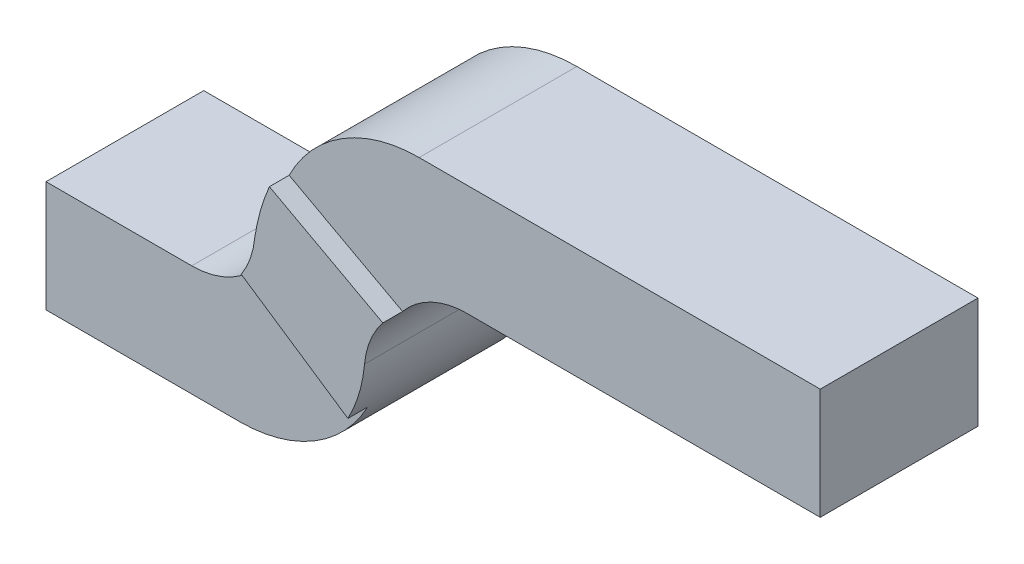
ISO-10303-21;
HEADER;
FILE_DESCRIPTION(('STEP AP214'),'2;1');
FILE_NAME('part.step','',(''),(''),'','','');
FILE_SCHEMA(('AUTOMOTIVE_DESIGN { 1 0 10303 214 1 1 1 1 }'));
ENDSEC;
DATA;
#1=APPLICATION_CONTEXT('core data for automotive mechanical design processes');
#2=APPLICATION_PROTOCOL_DEFINITION('international standard','automotive_design',2000,#1);
#3=PRODUCT_CONTEXT('',#1,'mechanical');
#4=PRODUCT('Part','Part','',(#3));
#5=PRODUCT_RELATED_PRODUCT_CATEGORY('part','',(#4));
#6=PRODUCT_DEFINITION_FORMATION('','',#4);
#7=PRODUCT_DEFINITION_CONTEXT('part definition',#1,'design');
#8=PRODUCT_DEFINITION('design','',#6,#7);
#9=PRODUCT_DEFINITION_SHAPE('','',#8);
#10=(LENGTH_UNIT() NAMED_UNIT(*) SI_UNIT(.MILLI.,.METRE.));
#11=(NAMED_UNIT(*) PLANE_ANGLE_UNIT() SI_UNIT($,.RADIAN.));
#12=(NAMED_UNIT(*) SI_UNIT($,.STERADIAN.) SOLID_ANGLE_UNIT());
#13=UNCERTAINTY_MEASURE_WITH_UNIT(LENGTH_MEASURE(1.E-05),#10,'distance_accuracy_value','');
#14=(GEOMETRIC_REPRESENTATION_CONTEXT(3) GLOBAL_UNCERTAINTY_ASSIGNED_CONTEXT((#13)) GLOBAL_UNIT_ASSIGNED_CONTEXT((#10,
#11,#12)) REPRESENTATION_CONTEXT('',''));
#15=CARTESIAN_POINT('',(0.,0.,0.));
#16=DIRECTION('',(0.,0.,1.));
#17=DIRECTION('',(1.,0.,0.));
#18=AXIS2_PLACEMENT_3D('',#15,#16,#17);
#19=CARTESIAN_POINT('',(-3.403007169133,-0.397885519354937,2.66));
#20=DIRECTION('',(0.556795491661779,0.830649613534562,0.));
#21=DIRECTION('',(-0.830649613534562,0.556795491661779,0.));
#22=AXIS2_PLACEMENT_3D('',#19,#20,#21);
#23=PLANE('',#22);
#24=DIRECTION('',(-0.830649613534562,0.556795491661779,0.));
#25=VECTOR('',#24,1.);
#26=CARTESIAN_POINT('',(-3.678554236215,-0.213182652836936,2.66));
#27=LINE('',#26,#25);
#28=CARTESIAN_POINT('',(-3.403007169133,-0.397885519354937,2.66));
#29=VERTEX_POINT('',#28);
#30=CARTESIAN_POINT('',(-3.917041555427,-0.0533214285714333,2.66));
#31=VERTEX_POINT('',#30);
#32=EDGE_CURVE('E11',#29,#31,#27,.T.);
#33=ORIENTED_EDGE('',*,*,#32,.F.);
#34=DIRECTION('',(0.,0.,1.));
#35=VECTOR('',#34,1.);
#36=CARTESIAN_POINT('',(-3.403007169133,-0.397885519354937,2.66));
#37=LINE('',#36,#35);
#38=CARTESIAN_POINT('',(-3.403007169133,-0.397885519354937,2.755));
#39=VERTEX_POINT('',#38);
#40=EDGE_CURVE('E24',#29,#39,#37,.T.);
#41=ORIENTED_EDGE('',*,*,#40,.T.);
#42=DIRECTION('',(-0.830649613534562,0.556795491661779,0.));
#43=VECTOR('',#42,1.);
#44=CARTESIAN_POINT('',(-3.403007169133,-0.397885519354937,2.755));
#45=LINE('',#44,#43);
#46=CARTESIAN_POINT('',(-3.917041555427,-0.0533214285714333,2.755));
#47=VERTEX_POINT('',#46);
#48=EDGE_CURVE('E305',#39,#47,#45,.T.);
#49=ORIENTED_EDGE('',*,*,#48,.T.);
#50=DIRECTION('',(0.,0.,1.));
#51=VECTOR('',#50,1.);
#52=CARTESIAN_POINT('',(-3.917041555427,-0.0533214285714333,2.66));
#53=LINE('',#52,#51);
#54=EDGE_CURVE('E303',#31,#47,#53,.T.);
#55=ORIENTED_EDGE('',*,*,#54,.F.);
#56=EDGE_LOOP('',(#33,#41,#49,#55));
#57=FACE_BOUND('',#56,.T.);
#58=ADVANCED_FACE('F17',(#57),#23,.F.);
#59=CARTESIAN_POINT('',(-2.86295437688,-0.0159202285700191,2.66));
#60=DIRECTION('',(0.,0.,-1.));
#61=DIRECTION('',(-0.989117940828201,0.147124774024568,0.));
#62=AXIS2_PLACEMENT_3D('',#59,#60,#61);
#63=CYLINDRICAL_SURFACE('',#62,0.999999999999969);
#64=CARTESIAN_POINT('',(-2.86295437688,-0.0159202285700191,2.66));
#65=DIRECTION('',(0.,0.,-1.));
#66=DIRECTION('',(-0.989117940828201,0.147124774024568,0.));
#67=AXIS2_PLACEMENT_3D('',#64,#65,#66);
#68=CIRCLE('',#67,0.999999999999969);
#69=CARTESIAN_POINT('',(-3.852072317709,0.131204545454545,2.66));
#70=VERTEX_POINT('',#69);
#71=CARTESIAN_POINT('',(-3.781179822614,0.380137886871121,2.66));
#72=VERTEX_POINT('',#71);
#73=EDGE_CURVE('E301',#70,#72,#68,.T.);
#74=ORIENTED_EDGE('',*,*,#73,.F.);
#75=DIRECTION('',(0.,0.,1.));
#76=VECTOR('',#75,1.);
#77=CARTESIAN_POINT('',(-3.852072317709,0.131204545454545,2.66));
#78=LINE('',#77,#76);
#79=CARTESIAN_POINT('',(-3.852072317709,0.131204545454545,2.755));
#80=VERTEX_POINT('',#79);
#81=EDGE_CURVE('E299',#70,#80,#78,.T.);
#82=ORIENTED_EDGE('',*,*,#81,.T.);
#83=CARTESIAN_POINT('',(-2.86295437688,-0.0159202285700191,2.755));
#84=DIRECTION('',(0.,0.,-1.));
#85=DIRECTION('',(-0.989117940828201,0.147124774024568,0.));
#86=AXIS2_PLACEMENT_3D('',#83,#84,#85);
#87=CIRCLE('',#86,0.999999999999969);
#88=CARTESIAN_POINT('',(-3.781179822614,0.380137886871121,2.755));
#89=VERTEX_POINT('',#88);
#90=EDGE_CURVE('E297',#80,#89,#87,.T.);
#91=ORIENTED_EDGE('',*,*,#90,.T.);
#92=DIRECTION('',(0.,0.,1.));
#93=VECTOR('',#92,1.);
#94=CARTESIAN_POINT('',(-3.781179822614,0.380137886871121,2.66));
#95=LINE('',#94,#93);
#96=EDGE_CURVE('E294',#72,#89,#95,.T.);
#97=ORIENTED_EDGE('',*,*,#96,.F.);
#98=EDGE_LOOP('',(#74,#82,#91,#97));
#99=FACE_BOUND('',#98,.T.);
#100=ADVANCED_FACE('F327',(#99),#63,.T.);
#101=CARTESIAN_POINT('',(-2.86295437688,-0.0159202285700191,2.66));
#102=DIRECTION('',(0.,0.,-1.));
#103=DIRECTION('',(-0.989117940828201,0.147124774024568,0.));
#104=AXIS2_PLACEMENT_3D('',#101,#102,#103);
#105=CYLINDRICAL_SURFACE('',#104,0.999999999999969);
#106=CARTESIAN_POINT('',(-2.86295437688,-0.0159202285700191,1.9));
#107=DIRECTION('',(0.,0.,1.));
#108=DIRECTION('',(-0.989117940828201,0.147124774024568,0.));
#109=AXIS2_PLACEMENT_3D('',#106,#107,#108);
#110=CIRCLE('',#109,0.999999999999969);
#111=CARTESIAN_POINT('',(-3.781179822614,0.380137886871121,1.9));
#112=VERTEX_POINT('',#111);
#113=CARTESIAN_POINT('',(-3.852072317709,0.131204545454545,1.9));
#114=VERTEX_POINT('',#113);
#115=EDGE_CURVE('E292',#112,#114,#110,.T.);
#116=ORIENTED_EDGE('',*,*,#115,.F.);
#117=DIRECTION('',(0.,0.,1.));
#118=VECTOR('',#117,1.);
#119=CARTESIAN_POINT('',(-3.781179822614,0.380137886871121,2.66));
#120=LINE('',#119,#118);
#121=CARTESIAN_POINT('',(-3.781179822614,0.380137886871121,1.805));
#122=VERTEX_POINT('',#121);
#123=EDGE_CURVE('E289',#122,#112,#120,.T.);
#124=ORIENTED_EDGE('',*,*,#123,.F.);
#125=CARTESIAN_POINT('',(-2.86295437688,-0.0159202285700191,1.805));
#126=DIRECTION('',(0.,0.,1.));
#127=DIRECTION('',(-0.989117940828201,0.147124774024568,0.));
#128=AXIS2_PLACEMENT_3D('',#125,#126,#127);
#129=CIRCLE('',#128,0.999999999999969);
#130=CARTESIAN_POINT('',(-3.852072317709,0.131204545454545,1.805));
#131=VERTEX_POINT('',#130);
#132=EDGE_CURVE('E287',#122,#131,#129,.T.);
#133=ORIENTED_EDGE('',*,*,#132,.T.);
#134=DIRECTION('',(0.,0.,1.));
#135=VECTOR('',#134,1.);
#136=CARTESIAN_POINT('',(-3.852072317709,0.131204545454545,2.66));
#137=LINE('',#136,#135);
#138=EDGE_CURVE('E284',#131,#114,#137,.T.);
#139=ORIENTED_EDGE('',*,*,#138,.T.);
#140=EDGE_LOOP('',(#116,#124,#133,#139));
#141=FACE_BOUND('',#140,.T.);
#142=ADVANCED_FACE('F354',(#141),#105,.T.);
#143=CARTESIAN_POINT('',(-3.781179822614,0.380137886871121,2.66));
#144=DIRECTION('',(-0.475278242984144,-0.879835548125845,0.));
#145=DIRECTION('',(0.879835548125845,-0.475278242984144,0.));
#146=AXIS2_PLACEMENT_3D('',#143,#144,#145);
#147=PLANE('',#146);
#148=DIRECTION('',(0.879835548125845,-0.475278242984144,0.));
#149=VECTOR('',#148,1.);
#150=CARTESIAN_POINT('',(-3.786410356881,0.382963368452674,2.66));
#151=LINE('',#150,#149);
#152=CARTESIAN_POINT('',(-3.23468731074,0.0849281725091644,2.66));
#153=VERTEX_POINT('',#152);
#154=EDGE_CURVE('E282',#72,#153,#151,.T.);
#155=ORIENTED_EDGE('',*,*,#154,.F.);
#156=ORIENTED_EDGE('',*,*,#96,.T.);
#157=DIRECTION('',(0.879835548125845,-0.475278242984144,0.));
#158=VECTOR('',#157,1.);
#159=CARTESIAN_POINT('',(-3.781179822614,0.380137886871121,2.755));
#160=LINE('',#159,#158);
#161=CARTESIAN_POINT('',(-3.23468731074,0.0849281725091644,2.755));
#162=VERTEX_POINT('',#161);
#163=EDGE_CURVE('E280',#89,#162,#160,.T.);
#164=ORIENTED_EDGE('',*,*,#163,.T.);
#165=DIRECTION('',(0.,0.,1.));
#166=VECTOR('',#165,1.);
#167=CARTESIAN_POINT('',(-3.23468731074,0.0849281725091644,2.66));
#168=LINE('',#167,#166);
#169=EDGE_CURVE('E277',#153,#162,#168,.T.);
#170=ORIENTED_EDGE('',*,*,#169,.F.);
#171=EDGE_LOOP('',(#155,#156,#164,#170));
#172=FACE_BOUND('',#171,.T.);
#173=ADVANCED_FACE('F323',(#172),#147,.F.);
#174=CARTESIAN_POINT('',(-3.781179822614,0.380137886871121,2.66));
#175=DIRECTION('',(-0.475278242984144,-0.879835548125845,0.));
#176=DIRECTION('',(0.879835548125845,-0.475278242984144,0.));
#177=AXIS2_PLACEMENT_3D('',#174,#175,#176);
#178=PLANE('',#177);
#179=DIRECTION('',(-0.879835548125845,0.475278242984144,0.));
#180=VECTOR('',#179,1.);
#181=CARTESIAN_POINT('',(-2.871767942995,-0.111117190529642,1.9));
#182=LINE('',#181,#180);
#183=CARTESIAN_POINT('',(-3.23468731074,0.0849281725091644,1.9));
#184=VERTEX_POINT('',#183);
#185=EDGE_CURVE('E274',#184,#112,#182,.T.);
#186=ORIENTED_EDGE('',*,*,#185,.F.);
#187=DIRECTION('',(0.,0.,1.));
#188=VECTOR('',#187,1.);
#189=CARTESIAN_POINT('',(-3.23468731074,0.0849281725091644,2.66));
#190=LINE('',#189,#188);
#191=CARTESIAN_POINT('',(-3.23468731074,0.0849281725091644,1.805));
#192=VERTEX_POINT('',#191);
#193=EDGE_CURVE('E271',#192,#184,#190,.T.);
#194=ORIENTED_EDGE('',*,*,#193,.F.);
#195=DIRECTION('',(-0.879835548125845,0.475278242984144,0.));
#196=VECTOR('',#195,1.);
#197=CARTESIAN_POINT('',(-3.781179822614,0.380137886871121,1.805));
#198=LINE('',#197,#196);
#199=EDGE_CURVE('E268',#192,#122,#198,.T.);
#200=ORIENTED_EDGE('',*,*,#199,.T.);
#201=ORIENTED_EDGE('',*,*,#123,.T.);
#202=EDGE_LOOP('',(#186,#194,#200,#201));
#203=FACE_BOUND('',#202,.T.);
#204=ADVANCED_FACE('F363',(#203),#178,.F.);
#205=CARTESIAN_POINT('',(-3.578362557757,0.000382367456053226,1.805));
#206=DIRECTION('',(0.,0.,1.));
#207=DIRECTION('',(1.,0.,0.));
#208=AXIS2_PLACEMENT_3D('',#205,#206,#207);
#209=PLANE('',#208);
#210=CARTESIAN_POINT('',(-4.02,-0.0672500000000006,1.805));
#211=DIRECTION('',(0.,0.,1.));
#212=DIRECTION('',(0.995817596726636,-0.091363636363636,0.));
#213=AXIS2_PLACEMENT_3D('',#210,#211,#212);
#214=CIRCLE('',#213,0.7);
#215=CARTESIAN_POINT('',(-3.403007169133,-0.397885519354937,1.805));
#216=VERTEX_POINT('',#215);
#217=CARTESIAN_POINT('',(-3.322927682291,-0.131204545454546,1.805));
#218=VERTEX_POINT('',#217);
#219=EDGE_CURVE('E266',#216,#218,#214,.T.);
#220=ORIENTED_EDGE('',*,*,#219,.F.);
#221=DIRECTION('',(0.830649613534562,-0.556795491661779,0.));
#222=VECTOR('',#221,1.);
#223=CARTESIAN_POINT('',(-3.403007169133,-0.397885519354937,1.805));
#224=LINE('',#223,#222);
#225=CARTESIAN_POINT('',(-3.917041555427,-0.0533214285714333,1.805));
#226=VERTEX_POINT('',#225);
#227=EDGE_CURVE('E263',#226,#216,#224,.T.);
#228=ORIENTED_EDGE('',*,*,#227,.F.);
#229=CARTESIAN_POINT('',(-4.250399356399,0.167750000000002,1.805));
#230=DIRECTION('',(0.,0.,-1.));
#231=DIRECTION('',(-0.995817596726636,0.091363636363637,0.));
#232=AXIS2_PLACEMENT_3D('',#229,#230,#231);
#233=CIRCLE('',#232,0.400000000000023);
#234=EDGE_CURVE('E260',#131,#226,#233,.T.);
#235=ORIENTED_EDGE('',*,*,#234,.F.);
#236=ORIENTED_EDGE('',*,*,#132,.F.);
#237=ORIENTED_EDGE('',*,*,#199,.F.);
#238=CARTESIAN_POINT('',(-2.924600643601,-0.167749999999997,1.805));
#239=DIRECTION('',(0.,0.,-1.));
#240=DIRECTION('',(0.995817596726637,-0.09136363636363,0.));
#241=AXIS2_PLACEMENT_3D('',#238,#239,#240);
#242=CIRCLE('',#241,0.399999999999992);
#243=EDGE_CURVE('E257',#218,#192,#242,.T.);
#244=ORIENTED_EDGE('',*,*,#243,.F.);
#245=EDGE_LOOP('',(#220,#228,#235,#236,#237,#244));
#246=FACE_BOUND('',#245,.T.);
#247=ADVANCED_FACE('F366',(#246),#209,.F.);
#248=CARTESIAN_POINT('',(-3.403007169133,-0.397885519354937,2.66));
#249=DIRECTION('',(0.556795491661779,0.830649613534562,0.));
#250=DIRECTION('',(-0.830649613534562,0.556795491661779,0.));
#251=AXIS2_PLACEMENT_3D('',#248,#249,#250);
#252=PLANE('',#251);
#253=DIRECTION('',(0.830649613534562,-0.556795491661779,0.));
#254=VECTOR('',#253,1.);
#255=CARTESIAN_POINT('',(-2.92019406112,-0.721521571760761,1.9));
#256=LINE('',#255,#254);
#257=CARTESIAN_POINT('',(-3.917041555427,-0.0533214285714333,1.9));
#258=VERTEX_POINT('',#257);
#259=CARTESIAN_POINT('',(-3.403007169133,-0.397885519354936,1.9));
#260=VERTEX_POINT('',#259);
#261=EDGE_CURVE('E255',#258,#260,#256,.T.);
#262=ORIENTED_EDGE('',*,*,#261,.F.);
#263=DIRECTION('',(0.,0.,1.));
#264=VECTOR('',#263,1.);
#265=CARTESIAN_POINT('',(-3.917041555427,-0.0533214285714333,2.66));
#266=LINE('',#265,#264);
#267=EDGE_CURVE('E253',#226,#258,#266,.T.);
#268=ORIENTED_EDGE('',*,*,#267,.F.);
#269=ORIENTED_EDGE('',*,*,#227,.T.);
#270=DIRECTION('',(0.,0.,1.));
#271=VECTOR('',#270,1.);
#272=CARTESIAN_POINT('',(-3.403007169133,-0.397885519354937,2.66));
#273=LINE('',#272,#271);
#274=EDGE_CURVE('E250',#216,#260,#273,.T.);
#275=ORIENTED_EDGE('',*,*,#274,.T.);
#276=EDGE_LOOP('',(#262,#268,#269,#275));
#277=FACE_BOUND('',#276,.T.);
#278=ADVANCED_FACE('F370',(#277),#252,.F.);
#279=CARTESIAN_POINT('',(-3.578362557757,0.000382367456053226,2.755));
#280=DIRECTION('',(0.,0.,1.));
#281=DIRECTION('',(1.,0.,0.));
#282=AXIS2_PLACEMENT_3D('',#279,#280,#281);
#283=PLANE('',#282);
#284=CARTESIAN_POINT('',(-4.02,-0.0672500000000006,2.755));
#285=DIRECTION('',(0.,0.,-1.));
#286=DIRECTION('',(0.995817596726636,-0.091363636363636,0.));
#287=AXIS2_PLACEMENT_3D('',#284,#285,#286);
#288=CIRCLE('',#287,0.7);
#289=CARTESIAN_POINT('',(-3.322927682291,-0.131204545454546,2.755));
#290=VERTEX_POINT('',#289);
#291=EDGE_CURVE('E247',#290,#39,#288,.T.);
#292=ORIENTED_EDGE('',*,*,#291,.F.);
#293=CARTESIAN_POINT('',(-2.924600643601,-0.167749999999997,2.755));
#294=DIRECTION('',(0.,0.,1.));
#295=DIRECTION('',(0.995817596726637,-0.09136363636363,0.));
#296=AXIS2_PLACEMENT_3D('',#293,#294,#295);
#297=CIRCLE('',#296,0.399999999999992);
#298=EDGE_CURVE('E244',#162,#290,#297,.T.);
#299=ORIENTED_EDGE('',*,*,#298,.F.);
#300=ORIENTED_EDGE('',*,*,#163,.F.);
#301=ORIENTED_EDGE('',*,*,#90,.F.);
#302=CARTESIAN_POINT('',(-4.250399356399,0.167750000000002,2.755));
#303=DIRECTION('',(0.,0.,1.));
#304=DIRECTION('',(-0.995817596726636,0.091363636363637,0.));
#305=AXIS2_PLACEMENT_3D('',#302,#303,#304);
#306=CIRCLE('',#305,0.400000000000023);
#307=EDGE_CURVE('E241',#47,#80,#306,.T.);
#308=ORIENTED_EDGE('',*,*,#307,.F.);
#309=ORIENTED_EDGE('',*,*,#48,.F.);
#310=EDGE_LOOP('',(#292,#299,#300,#301,#308,#309));
#311=FACE_BOUND('',#310,.T.);
#312=ADVANCED_FACE('F310',(#311),#283,.T.);
#313=CARTESIAN_POINT('',(-4.02,-0.0672500000000006,0.));
#314=DIRECTION('',(0.,0.,1.));
#315=DIRECTION('',(0.707106781186547,-0.707106781186548,0.));
#316=AXIS2_PLACEMENT_3D('',#313,#314,#315);
#317=CYLINDRICAL_SURFACE('',#316,0.7);
#318=CARTESIAN_POINT('',(-4.02,-0.0672500000000006,2.66));
#319=DIRECTION('',(0.,0.,-1.));
#320=DIRECTION('',(0.707106781186547,-0.707106781186548,0.));
#321=AXIS2_PLACEMENT_3D('',#318,#319,#320);
#322=CIRCLE('',#321,0.7);
#323=CARTESIAN_POINT('',(-4.02,-0.767250000000001,2.66));
#324=VERTEX_POINT('',#323);
#325=EDGE_CURVE('E239',#29,#324,#322,.T.);
#326=ORIENTED_EDGE('',*,*,#325,.T.);
#327=DIRECTION('',(0.,0.,-1.));
#328=VECTOR('',#327,1.);
#329=CARTESIAN_POINT('',(-4.02,-0.767250000000001,0.));
#330=LINE('',#329,#328);
#331=CARTESIAN_POINT('',(-4.02,-0.767250000000001,1.9));
#332=VERTEX_POINT('',#331);
#333=EDGE_CURVE('E237',#324,#332,#330,.T.);
#334=ORIENTED_EDGE('',*,*,#333,.T.);
#335=CARTESIAN_POINT('',(-4.02,-0.0672500000000006,1.9));
#336=DIRECTION('',(0.,0.,1.));
#337=DIRECTION('',(0.707106781186547,-0.707106781186548,0.));
#338=AXIS2_PLACEMENT_3D('',#335,#336,#337);
#339=CIRCLE('',#338,0.7);
#340=EDGE_CURVE('E234',#332,#260,#339,.T.);
#341=ORIENTED_EDGE('',*,*,#340,.T.);
#342=ORIENTED_EDGE('',*,*,#274,.F.);
#343=ORIENTED_EDGE('',*,*,#219,.T.);
#344=DIRECTION('',(0.,0.,-1.));
#345=VECTOR('',#344,1.);
#346=CARTESIAN_POINT('',(-3.322927682291,-0.131204545454546,2.66));
#347=LINE('',#346,#345);
#348=EDGE_CURVE('E231',#290,#218,#347,.T.);
#349=ORIENTED_EDGE('',*,*,#348,.F.);
#350=ORIENTED_EDGE('',*,*,#291,.T.);
#351=ORIENTED_EDGE('',*,*,#40,.F.);
#352=EDGE_LOOP('',(#326,#334,#341,#342,#343,#349,#350,#351));
#353=FACE_BOUND('',#352,.T.);
#354=ADVANCED_FACE('F314',(#353),#317,.T.);
#355=CARTESIAN_POINT('',(-1.2225,0.767249999999999,1.9));
#356=DIRECTION('',(0.,0.,1.));
#357=DIRECTION('',(-1.,0.,0.));
#358=AXIS2_PLACEMENT_3D('',#355,#356,#357);
#359=PLANE('',#358);
#360=ORIENTED_EDGE('',*,*,#185,.T.);
#361=CARTESIAN_POINT('',(-3.155,0.0672499999999988,1.9));
#362=DIRECTION('',(0.,0.,1.));
#363=DIRECTION('',(-0.707106781186547,0.707106781186548,0.));
#364=AXIS2_PLACEMENT_3D('',#361,#362,#363);
#365=CIRCLE('',#364,0.7);
#366=CARTESIAN_POINT('',(-3.155,0.767249999999999,1.9));
#367=VERTEX_POINT('',#366);
#368=EDGE_CURVE('E228',#367,#112,#365,.T.);
#369=ORIENTED_EDGE('',*,*,#368,.F.);
#370=DIRECTION('',(-1.,0.,0.));
#371=VECTOR('',#370,1.);
#372=CARTESIAN_POINT('',(-2.27125,0.767249999999999,1.9));
#373=LINE('',#372,#371);
#374=CARTESIAN_POINT('',(-1.2225,0.767249999999999,1.9));
#375=VERTEX_POINT('',#374);
#376=EDGE_CURVE('E225',#375,#367,#373,.T.);
#377=ORIENTED_EDGE('',*,*,#376,.F.);
#378=DIRECTION('',(0.,1.,0.));
#379=VECTOR('',#378,1.);
#380=CARTESIAN_POINT('',(-1.2225,0.499749999999999,1.9));
#381=LINE('',#380,#379);
#382=CARTESIAN_POINT('',(-1.2225,0.23225,1.9));
#383=VERTEX_POINT('',#382);
#384=EDGE_CURVE('E222',#383,#375,#381,.T.);
#385=ORIENTED_EDGE('',*,*,#384,.F.);
#386=DIRECTION('',(1.,0.,0.));
#387=VECTOR('',#386,1.);
#388=CARTESIAN_POINT('',(-1.7225,0.23225,1.9));
#389=LINE('',#388,#387);
#390=CARTESIAN_POINT('',(-2.924600643601,0.23225,1.9));
#391=VERTEX_POINT('',#390);
#392=EDGE_CURVE('E219',#391,#383,#389,.T.);
#393=ORIENTED_EDGE('',*,*,#392,.F.);
#394=CARTESIAN_POINT('',(-2.924600643601,-0.16775,1.9));
#395=DIRECTION('',(0.,0.,-1.));
#396=DIRECTION('',(0.,-1.,0.));
#397=AXIS2_PLACEMENT_3D('',#394,#395,#396);
#398=CIRCLE('',#397,0.4);
#399=EDGE_CURVE('E216',#184,#391,#398,.T.);
#400=ORIENTED_EDGE('',*,*,#399,.F.);
#401=EDGE_LOOP('',(#360,#369,#377,#385,#393,#400));
#402=FACE_BOUND('',#401,.T.);
#403=ADVANCED_FACE('F379',(#402),#359,.F.);
#404=CARTESIAN_POINT('',(-1.2225,0.767249999999999,1.9));
#405=DIRECTION('',(0.,0.,1.));
#406=DIRECTION('',(-1.,0.,0.));
#407=AXIS2_PLACEMENT_3D('',#404,#405,#406);
#408=PLANE('',#407);
#409=ORIENTED_EDGE('',*,*,#115,.T.);
#410=CARTESIAN_POINT('',(-3.155,0.0672499999999988,1.9));
#411=DIRECTION('',(0.,0.,1.));
#412=DIRECTION('',(-0.707106781186547,0.707106781186548,0.));
#413=AXIS2_PLACEMENT_3D('',#410,#411,#412);
#414=CIRCLE('',#413,0.7);
#415=EDGE_CURVE('E213',#112,#114,#414,.T.);
#416=ORIENTED_EDGE('',*,*,#415,.F.);
#417=EDGE_LOOP('',(#409,#416));
#418=FACE_BOUND('',#417,.T.);
#419=ADVANCED_FACE('F382',(#418),#408,.F.);
#420=CARTESIAN_POINT('',(-1.2225,0.767249999999999,1.9));
#421=DIRECTION('',(0.,0.,1.));
#422=DIRECTION('',(-1.,0.,0.));
#423=AXIS2_PLACEMENT_3D('',#420,#421,#422);
#424=PLANE('',#423);
#425=ORIENTED_EDGE('',*,*,#261,.T.);
#426=ORIENTED_EDGE('',*,*,#340,.F.);
#427=DIRECTION('',(1.,0.,0.));
#428=VECTOR('',#427,1.);
#429=CARTESIAN_POINT('',(-2.53875,-0.767250000000001,1.9));
#430=LINE('',#429,#428);
#431=CARTESIAN_POINT('',(-4.9525,-0.76725,1.9));
#432=VERTEX_POINT('',#431);
#433=EDGE_CURVE('E210',#432,#332,#430,.T.);
#434=ORIENTED_EDGE('',*,*,#433,.F.);
#435=DIRECTION('',(0.,-1.,0.));
#436=VECTOR('',#435,1.);
#437=CARTESIAN_POINT('',(-4.9525,0.267499999999999,1.9));
#438=LINE('',#437,#436);
#439=CARTESIAN_POINT('',(-4.9525,-0.232250000000001,1.9));
#440=VERTEX_POINT('',#439);
#441=EDGE_CURVE('E207',#440,#432,#438,.T.);
#442=ORIENTED_EDGE('',*,*,#441,.F.);
#443=DIRECTION('',(-1.,0.,0.));
#444=VECTOR('',#443,1.);
#445=CARTESIAN_POINT('',(-2.405,-0.23225,1.9));
#446=LINE('',#445,#444);
#447=CARTESIAN_POINT('',(-4.250399356399,-0.23225,1.9));
#448=VERTEX_POINT('',#447);
#449=EDGE_CURVE('E205',#448,#440,#446,.T.);
#450=ORIENTED_EDGE('',*,*,#449,.F.);
#451=CARTESIAN_POINT('',(-4.250399356399,0.16775,1.9));
#452=DIRECTION('',(0.,0.,-1.));
#453=DIRECTION('',(0.,1.,0.));
#454=AXIS2_PLACEMENT_3D('',#451,#452,#453);
#455=CIRCLE('',#454,0.4);
#456=EDGE_CURVE('E165',#258,#448,#455,.T.);
#457=ORIENTED_EDGE('',*,*,#456,.F.);
#458=EDGE_LOOP('',(#425,#426,#434,#442,#450,#457));
#459=FACE_BOUND('',#458,.T.);
#460=ADVANCED_FACE('F386',(#459),#424,.F.);
#461=CARTESIAN_POINT('',(-3.155,0.0672499999999988,0.));
#462=DIRECTION('',(0.,0.,1.));
#463=DIRECTION('',(-0.707106781186547,0.707106781186548,0.));
#464=AXIS2_PLACEMENT_3D('',#461,#462,#463);
#465=CYLINDRICAL_SURFACE('',#464,0.7);
#466=CARTESIAN_POINT('',(-3.155,0.0672499999999988,2.66));
#467=DIRECTION('',(0.,0.,-1.));
#468=DIRECTION('',(-0.707106781186547,0.707106781186548,0.));
#469=AXIS2_PLACEMENT_3D('',#466,#467,#468);
#470=CIRCLE('',#469,0.7);
#471=CARTESIAN_POINT('',(-3.155,0.767249999999999,2.66));
#472=VERTEX_POINT('',#471);
#473=EDGE_CURVE('E202',#72,#472,#470,.T.);
#474=ORIENTED_EDGE('',*,*,#473,.T.);
#475=DIRECTION('',(0.,0.,-1.));
#476=VECTOR('',#475,1.);
#477=CARTESIAN_POINT('',(-3.155,0.767249999999999,0.));
#478=LINE('',#477,#476);
#479=EDGE_CURVE('E199',#472,#367,#478,.T.);
#480=ORIENTED_EDGE('',*,*,#479,.T.);
#481=ORIENTED_EDGE('',*,*,#368,.T.);
#482=ORIENTED_EDGE('',*,*,#415,.T.);
#483=DIRECTION('',(0.,0.,-1.));
#484=VECTOR('',#483,1.);
#485=CARTESIAN_POINT('',(-3.852072317709,0.131204545454545,0.));
#486=LINE('',#485,#484);
#487=EDGE_CURVE('E196',#70,#114,#486,.T.);
#488=ORIENTED_EDGE('',*,*,#487,.F.);
#489=CARTESIAN_POINT('',(-3.155,0.0672499999999988,2.66));
#490=DIRECTION('',(0.,0.,-1.));
#491=DIRECTION('',(-0.707106781186547,0.707106781186548,0.));
#492=AXIS2_PLACEMENT_3D('',#489,#490,#491);
#493=CIRCLE('',#492,0.7);
#494=EDGE_CURVE('E193',#70,#72,#493,.T.);
#495=ORIENTED_EDGE('',*,*,#494,.T.);
#496=EDGE_LOOP('',(#474,#480,#481,#482,#488,#495));
#497=FACE_BOUND('',#496,.T.);
#498=ADVANCED_FACE('F333',(#497),#465,.T.);
#499=CARTESIAN_POINT('',(-4.27,-0.499750000000001,2.66));
#500=DIRECTION('',(0.,0.,1.));
#501=DIRECTION('',(1.,0.,0.));
#502=AXIS2_PLACEMENT_3D('',#499,#500,#501);
#503=PLANE('',#502);
#504=ORIENTED_EDGE('',*,*,#154,.T.);
#505=CARTESIAN_POINT('',(-2.924600643601,-0.16775,2.66));
#506=DIRECTION('',(0.,0.,1.));
#507=DIRECTION('',(0.,-1.,0.));
#508=AXIS2_PLACEMENT_3D('',#505,#506,#507);
#509=CIRCLE('',#508,0.4);
#510=CARTESIAN_POINT('',(-2.924600643601,0.232249999999999,2.66));
#511=VERTEX_POINT('',#510);
#512=EDGE_CURVE('E190',#511,#153,#509,.T.);
#513=ORIENTED_EDGE('',*,*,#512,.F.);
#514=DIRECTION('',(1.,0.,0.));
#515=VECTOR('',#514,1.);
#516=CARTESIAN_POINT('',(-3.5875,0.232249999999999,2.66));
#517=LINE('',#516,#515);
#518=CARTESIAN_POINT('',(-1.2225,0.23225,2.66));
#519=VERTEX_POINT('',#518);
#520=EDGE_CURVE('E188',#511,#519,#517,.T.);
#521=ORIENTED_EDGE('',*,*,#520,.T.);
#522=DIRECTION('',(0.,1.,0.));
#523=VECTOR('',#522,1.);
#524=CARTESIAN_POINT('',(-1.2225,0.23225,2.66));
#525=LINE('',#524,#523);
#526=CARTESIAN_POINT('',(-1.2225,0.76725,2.66));
#527=VERTEX_POINT('',#526);
#528=EDGE_CURVE('E186',#519,#527,#525,.T.);
#529=ORIENTED_EDGE('',*,*,#528,.T.);
#530=DIRECTION('',(-1.,0.,0.));
#531=VECTOR('',#530,1.);
#532=CARTESIAN_POINT('',(-2.2225,0.76725,2.66));
#533=LINE('',#532,#531);
#534=EDGE_CURVE('E183',#527,#472,#533,.T.);
#535=ORIENTED_EDGE('',*,*,#534,.T.);
#536=ORIENTED_EDGE('',*,*,#473,.F.);
#537=EDGE_LOOP('',(#504,#513,#521,#529,#535,#536));
#538=FACE_BOUND('',#537,.T.);
#539=ADVANCED_FACE('F339',(#538),#503,.T.);
#540=CARTESIAN_POINT('',(-4.27,-0.499750000000001,2.66));
#541=DIRECTION('',(0.,0.,1.));
#542=DIRECTION('',(1.,0.,0.));
#543=AXIS2_PLACEMENT_3D('',#540,#541,#542);
#544=PLANE('',#543);
#545=ORIENTED_EDGE('',*,*,#73,.T.);
#546=ORIENTED_EDGE('',*,*,#494,.F.);
#547=EDGE_LOOP('',(#545,#546));
#548=FACE_BOUND('',#547,.T.);
#549=ADVANCED_FACE('F336',(#548),#544,.T.);
#550=CARTESIAN_POINT('',(-4.9525,-0.232250000000001,0.));
#551=DIRECTION('',(-1.,0.,0.));
#552=DIRECTION('',(0.,-1.,0.));
#553=AXIS2_PLACEMENT_3D('',#550,#551,#552);
#554=PLANE('',#553);
#555=ORIENTED_EDGE('',*,*,#441,.T.);
#556=DIRECTION('',(0.,0.,1.));
#557=VECTOR('',#556,1.);
#558=CARTESIAN_POINT('',(-4.9525,-0.767250000000001,0.));
#559=LINE('',#558,#557);
#560=CARTESIAN_POINT('',(-4.9525,-0.767250000000001,2.66));
#561=VERTEX_POINT('',#560);
#562=EDGE_CURVE('E181',#432,#561,#559,.T.);
#563=ORIENTED_EDGE('',*,*,#562,.T.);
#564=DIRECTION('',(0.,-1.,0.));
#565=VECTOR('',#564,1.);
#566=CARTESIAN_POINT('',(-4.9525,-0.232250000000001,2.66));
#567=LINE('',#566,#565);
#568=CARTESIAN_POINT('',(-4.9525,-0.232250000000001,2.66));
#569=VERTEX_POINT('',#568);
#570=EDGE_CURVE('E179',#569,#561,#567,.T.);
#571=ORIENTED_EDGE('',*,*,#570,.F.);
#572=DIRECTION('',(0.,0.,1.));
#573=VECTOR('',#572,1.);
#574=CARTESIAN_POINT('',(-4.9525,-0.232250000000001,0.));
#575=LINE('',#574,#573);
#576=EDGE_CURVE('E150',#440,#569,#575,.T.);
#577=ORIENTED_EDGE('',*,*,#576,.F.);
#578=EDGE_LOOP('',(#555,#563,#571,#577));
#579=FACE_BOUND('',#578,.T.);
#580=ADVANCED_FACE('F338',(#579),#554,.T.);
#581=CARTESIAN_POINT('',(-4.27,-0.499750000000001,2.66));
#582=DIRECTION('',(0.,0.,1.));
#583=DIRECTION('',(1.,0.,0.));
#584=AXIS2_PLACEMENT_3D('',#581,#582,#583);
#585=PLANE('',#584);
#586=ORIENTED_EDGE('',*,*,#32,.T.);
#587=CARTESIAN_POINT('',(-4.250399356399,0.16775,2.66));
#588=DIRECTION('',(0.,0.,1.));
#589=DIRECTION('',(0.,1.,0.));
#590=AXIS2_PLACEMENT_3D('',#587,#588,#589);
#591=CIRCLE('',#590,0.4);
#592=CARTESIAN_POINT('',(-4.250399356399,-0.23225,2.66));
#593=VERTEX_POINT('',#592);
#594=EDGE_CURVE('E142',#593,#31,#591,.T.);
#595=ORIENTED_EDGE('',*,*,#594,.F.);
#596=DIRECTION('',(-1.,0.,0.));
#597=VECTOR('',#596,1.);
#598=CARTESIAN_POINT('',(-3.5875,-0.23225,2.66));
#599=LINE('',#598,#597);
#600=EDGE_CURVE('E146',#593,#569,#599,.T.);
#601=ORIENTED_EDGE('',*,*,#600,.T.);
#602=ORIENTED_EDGE('',*,*,#570,.T.);
#603=DIRECTION('',(1.,0.,0.));
#604=VECTOR('',#603,1.);
#605=CARTESIAN_POINT('',(-3.855,-0.767250000000001,2.66));
#606=LINE('',#605,#604);
#607=EDGE_CURVE('E159',#561,#324,#606,.T.);
#608=ORIENTED_EDGE('',*,*,#607,.T.);
#609=ORIENTED_EDGE('',*,*,#325,.F.);
#610=EDGE_LOOP('',(#586,#595,#601,#602,#608,#609));
#611=FACE_BOUND('',#610,.T.);
#612=ADVANCED_FACE('F144',(#611),#585,.T.);
#613=CARTESIAN_POINT('',(-3.855,-0.767250000000001,0.));
#614=DIRECTION('',(0.,-1.,0.));
#615=DIRECTION('',(1.,0.,0.));
#616=AXIS2_PLACEMENT_3D('',#613,#614,#615);
#617=PLANE('',#616);
#618=ORIENTED_EDGE('',*,*,#433,.T.);
#619=ORIENTED_EDGE('',*,*,#333,.F.);
#620=ORIENTED_EDGE('',*,*,#607,.F.);
#621=ORIENTED_EDGE('',*,*,#562,.F.);
#622=EDGE_LOOP('',(#618,#619,#620,#621));
#623=FACE_BOUND('',#622,.T.);
#624=ADVANCED_FACE('F427',(#623),#617,.T.);
#625=CARTESIAN_POINT('',(-2.924600643601,-0.16775,0.));
#626=DIRECTION('',(0.,0.,1.));
#627=DIRECTION('',(0.,-1.,0.));
#628=AXIS2_PLACEMENT_3D('',#625,#626,#627);
#629=CYLINDRICAL_SURFACE('',#628,0.4);
#630=ORIENTED_EDGE('',*,*,#399,.T.);
#631=DIRECTION('',(0.,0.,1.));
#632=VECTOR('',#631,1.);
#633=CARTESIAN_POINT('',(-2.924600643601,0.23225,0.));
#634=LINE('',#633,#632);
#635=EDGE_CURVE('E166',#391,#511,#634,.T.);
#636=ORIENTED_EDGE('',*,*,#635,.T.);
#637=ORIENTED_EDGE('',*,*,#512,.T.);
#638=ORIENTED_EDGE('',*,*,#169,.T.);
#639=ORIENTED_EDGE('',*,*,#298,.T.);
#640=ORIENTED_EDGE('',*,*,#348,.T.);
#641=ORIENTED_EDGE('',*,*,#243,.T.);
#642=ORIENTED_EDGE('',*,*,#193,.T.);
#643=EDGE_LOOP('',(#630,#636,#637,#638,#639,#640,#641,#642));
#644=FACE_BOUND('',#643,.T.);
#645=ADVANCED_FACE('F318',(#644),#629,.F.);
#646=CARTESIAN_POINT('',(-4.250399356399,0.16775,0.));
#647=DIRECTION('',(0.,0.,1.));
#648=DIRECTION('',(0.,1.,0.));
#649=AXIS2_PLACEMENT_3D('',#646,#647,#648);
#650=CYLINDRICAL_SURFACE('',#649,0.4);
#651=ORIENTED_EDGE('',*,*,#456,.T.);
#652=DIRECTION('',(0.,0.,1.));
#653=VECTOR('',#652,1.);
#654=CARTESIAN_POINT('',(-4.250399356399,-0.23225,0.));
#655=LINE('',#654,#653);
#656=EDGE_CURVE('E157',#448,#593,#655,.T.);
#657=ORIENTED_EDGE('',*,*,#656,.T.);
#658=ORIENTED_EDGE('',*,*,#594,.T.);
#659=ORIENTED_EDGE('',*,*,#54,.T.);
#660=ORIENTED_EDGE('',*,*,#307,.T.);
#661=ORIENTED_EDGE('',*,*,#81,.F.);
#662=ORIENTED_EDGE('',*,*,#487,.T.);
#663=ORIENTED_EDGE('',*,*,#138,.F.);
#664=ORIENTED_EDGE('',*,*,#234,.T.);
#665=ORIENTED_EDGE('',*,*,#267,.T.);
#666=EDGE_LOOP('',(#651,#657,#658,#659,#660,#661,#662,#663,#664,#665));
#667=FACE_BOUND('',#666,.T.);
#668=ADVANCED_FACE('F162',(#667),#650,.F.);
#669=CARTESIAN_POINT('',(-3.5875,-0.23225,0.));
#670=DIRECTION('',(0.,1.,0.));
#671=DIRECTION('',(-1.,0.,0.));
#672=AXIS2_PLACEMENT_3D('',#669,#670,#671);
#673=PLANE('',#672);
#674=ORIENTED_EDGE('',*,*,#449,.T.);
#675=ORIENTED_EDGE('',*,*,#576,.T.);
#676=ORIENTED_EDGE('',*,*,#600,.F.);
#677=ORIENTED_EDGE('',*,*,#656,.F.);
#678=EDGE_LOOP('',(#674,#675,#676,#677));
#679=FACE_BOUND('',#678,.T.);
#680=ADVANCED_FACE('F156',(#679),#673,.T.);
#681=CARTESIAN_POINT('',(-3.32,0.767249999999999,0.));
#682=DIRECTION('',(0.,1.,0.));
#683=DIRECTION('',(-1.,0.,0.));
#684=AXIS2_PLACEMENT_3D('',#681,#682,#683);
#685=PLANE('',#684);
#686=ORIENTED_EDGE('',*,*,#376,.T.);
#687=ORIENTED_EDGE('',*,*,#479,.F.);
#688=ORIENTED_EDGE('',*,*,#534,.F.);
#689=DIRECTION('',(0.,0.,1.));
#690=VECTOR('',#689,1.);
#691=CARTESIAN_POINT('',(-1.2225,0.76725,0.));
#692=LINE('',#691,#690);
#693=EDGE_CURVE('E167',#375,#527,#692,.T.);
#694=ORIENTED_EDGE('',*,*,#693,.F.);
#695=EDGE_LOOP('',(#686,#687,#688,#694));
#696=FACE_BOUND('',#695,.T.);
#697=ADVANCED_FACE('F461',(#696),#685,.T.);
#698=CARTESIAN_POINT('',(-1.2225,0.23225,0.));
#699=DIRECTION('',(1.,0.,0.));
#700=DIRECTION('',(0.,1.,0.));
#701=AXIS2_PLACEMENT_3D('',#698,#699,#700);
#702=PLANE('',#701);
#703=ORIENTED_EDGE('',*,*,#384,.T.);
#704=ORIENTED_EDGE('',*,*,#693,.T.);
#705=ORIENTED_EDGE('',*,*,#528,.F.);
#706=DIRECTION('',(0.,0.,1.));
#707=VECTOR('',#706,1.);
#708=CARTESIAN_POINT('',(-1.2225,0.23225,0.));
#709=LINE('',#708,#707);
#710=EDGE_CURVE('E172',#383,#519,#709,.T.);
#711=ORIENTED_EDGE('',*,*,#710,.F.);
#712=EDGE_LOOP('',(#703,#704,#705,#711));
#713=FACE_BOUND('',#712,.T.);
#714=ADVANCED_FACE('F470',(#713),#702,.T.);
#715=CARTESIAN_POINT('',(-2.2225,0.23225,0.));
#716=DIRECTION('',(0.,-1.,0.));
#717=DIRECTION('',(1.,0.,0.));
#718=AXIS2_PLACEMENT_3D('',#715,#716,#717);
#719=PLANE('',#718);
#720=ORIENTED_EDGE('',*,*,#392,.T.);
#721=ORIENTED_EDGE('',*,*,#710,.T.);
#722=ORIENTED_EDGE('',*,*,#520,.F.);
#723=ORIENTED_EDGE('',*,*,#635,.F.);
#724=EDGE_LOOP('',(#720,#721,#722,#723));
#725=FACE_BOUND('',#724,.T.);
#726=ADVANCED_FACE('F480',(#725),#719,.T.);
#727=CLOSED_SHELL('',(#58,#100,#142,#173,#204,#247,#278,#312,#354,#403,#419,#460,#498,#539,#549,
#580,#612,#624,#645,#668,#680,#697,#714,#726));
#728=MANIFOLD_SOLID_BREP('B1',#727);
#729=ADVANCED_BREP_SHAPE_REPRESENTATION('',(#18,#728),#14);
#730=SHAPE_DEFINITION_REPRESENTATION(#9,#729);
ENDSEC;
END-ISO-10303-21;
